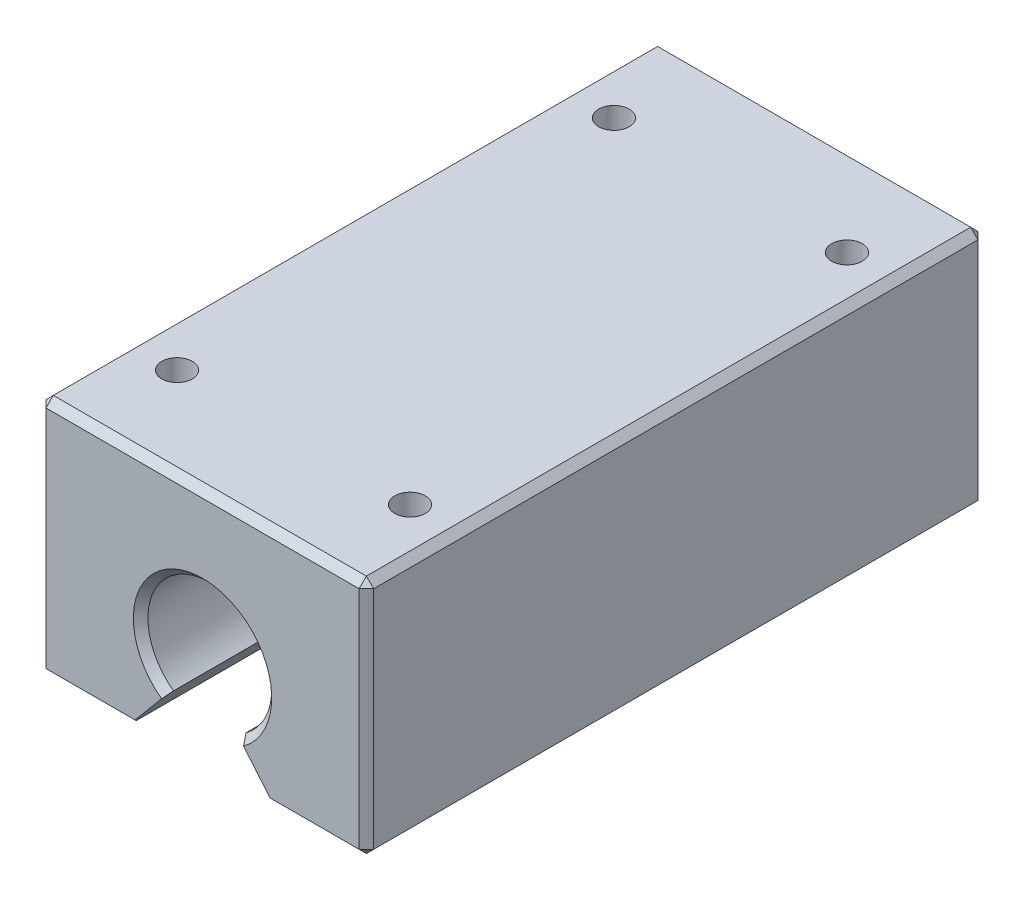
ISO-10303-21;
HEADER;
FILE_DESCRIPTION(('STEP AP214'),'2;1');
FILE_NAME('part.step','',(''),(''),'','','');
FILE_SCHEMA(('AUTOMOTIVE_DESIGN { 1 0 10303 214 1 1 1 1 }'));
ENDSEC;
DATA;
#1=APPLICATION_CONTEXT('core data for automotive mechanical design processes');
#2=APPLICATION_PROTOCOL_DEFINITION('international standard','automotive_design',2000,#1);
#3=PRODUCT_CONTEXT('',#1,'mechanical');
#4=PRODUCT('Part','Part','',(#3));
#5=PRODUCT_RELATED_PRODUCT_CATEGORY('part','',(#4));
#6=PRODUCT_DEFINITION_FORMATION('','',#4);
#7=PRODUCT_DEFINITION_CONTEXT('part definition',#1,'design');
#8=PRODUCT_DEFINITION('design','',#6,#7);
#9=PRODUCT_DEFINITION_SHAPE('','',#8);
#10=(LENGTH_UNIT() NAMED_UNIT(*) SI_UNIT(.MILLI.,.METRE.));
#11=(NAMED_UNIT(*) PLANE_ANGLE_UNIT() SI_UNIT($,.RADIAN.));
#12=(NAMED_UNIT(*) SI_UNIT($,.STERADIAN.) SOLID_ANGLE_UNIT());
#13=UNCERTAINTY_MEASURE_WITH_UNIT(LENGTH_MEASURE(1.E-05),#10,'distance_accuracy_value','');
#14=(GEOMETRIC_REPRESENTATION_CONTEXT(3) GLOBAL_UNCERTAINTY_ASSIGNED_CONTEXT((#13)) GLOBAL_UNIT_ASSIGNED_CONTEXT((#10,
#11,#12)) REPRESENTATION_CONTEXT('',''));
#15=CARTESIAN_POINT('',(0.,0.,0.));
#16=DIRECTION('',(0.,0.,1.));
#17=DIRECTION('',(1.,0.,0.));
#18=AXIS2_PLACEMENT_3D('',#15,#16,#17);
#19=CARTESIAN_POINT('',(-22.5,-16.5,85.));
#20=DIRECTION('',(0.,1.,0.));
#21=DIRECTION('',(0.,0.,1.));
#22=AXIS2_PLACEMENT_3D('',#19,#20,#21);
#23=PLANE('',#22);
#24=DIRECTION('',(0.,0.,1.));
#25=VECTOR('',#24,1.);
#26=CARTESIAN_POINT('',(21.5,-16.5,85.));
#27=LINE('',#26,#25);
#28=CARTESIAN_POINT('',(21.5,-16.5,1.));
#29=VERTEX_POINT('',#28);
#30=CARTESIAN_POINT('',(21.5,-16.5,84.));
#31=VERTEX_POINT('',#30);
#32=EDGE_CURVE('E341',#29,#31,#27,.T.);
#33=ORIENTED_EDGE('',*,*,#32,.T.);
#34=DIRECTION('',(-1.,0.,0.));
#35=VECTOR('',#34,1.);
#36=CARTESIAN_POINT('',(-22.5,-16.5,84.));
#37=LINE('',#36,#35);
#38=CARTESIAN_POINT('',(10.1133686516864,-16.5,84.));
#39=VERTEX_POINT('',#38);
#40=EDGE_CURVE('E343',#31,#39,#37,.T.);
#41=ORIENTED_EDGE('',*,*,#40,.T.);
#42=DIRECTION('',(0.,0.,-1.));
#43=VECTOR('',#42,1.);
#44=CARTESIAN_POINT('',(10.1133686516864,-16.5,85.));
#45=LINE('',#44,#43);
#46=CARTESIAN_POINT('',(10.1133686516864,-16.5,1.));
#47=VERTEX_POINT('',#46);
#48=EDGE_CURVE('E233',#39,#47,#45,.T.);
#49=ORIENTED_EDGE('',*,*,#48,.T.);
#50=DIRECTION('',(1.,0.,0.));
#51=VECTOR('',#50,1.);
#52=CARTESIAN_POINT('',(22.5,-16.5,1.));
#53=LINE('',#52,#51);
#54=EDGE_CURVE('E339',#47,#29,#53,.T.);
#55=ORIENTED_EDGE('',*,*,#54,.T.);
#56=EDGE_LOOP('',(#33,#41,#49,#55));
#57=FACE_BOUND('',#56,.T.);
#58=ADVANCED_FACE('F36',(#57),#23,.F.);
#59=CARTESIAN_POINT('',(22.5,-16.5,85.));
#60=DIRECTION('',(-1.,0.,0.));
#61=DIRECTION('',(0.,0.,1.));
#62=AXIS2_PLACEMENT_3D('',#59,#60,#61);
#63=PLANE('',#62);
#64=DIRECTION('',(0.,-1.,0.));
#65=VECTOR('',#64,1.);
#66=CARTESIAN_POINT('',(22.5,-16.5,84.));
#67=LINE('',#66,#65);
#68=CARTESIAN_POINT('',(22.5,15.5,84.));
#69=VERTEX_POINT('',#68);
#70=CARTESIAN_POINT('',(22.5,-15.5,84.));
#71=VERTEX_POINT('',#70);
#72=EDGE_CURVE('E364',#69,#71,#67,.T.);
#73=ORIENTED_EDGE('',*,*,#72,.T.);
#74=DIRECTION('',(0.,0.,-1.));
#75=VECTOR('',#74,1.);
#76=CARTESIAN_POINT('',(22.5,-15.5,85.));
#77=LINE('',#76,#75);
#78=CARTESIAN_POINT('',(22.5,-15.5,1.));
#79=VERTEX_POINT('',#78);
#80=EDGE_CURVE('E366',#71,#79,#77,.T.);
#81=ORIENTED_EDGE('',*,*,#80,.T.);
#82=DIRECTION('',(0.,1.,0.));
#83=VECTOR('',#82,1.);
#84=CARTESIAN_POINT('',(22.5,16.5,1.));
#85=LINE('',#84,#83);
#86=CARTESIAN_POINT('',(22.5,15.5,1.));
#87=VERTEX_POINT('',#86);
#88=EDGE_CURVE('E360',#79,#87,#85,.T.);
#89=ORIENTED_EDGE('',*,*,#88,.T.);
#90=DIRECTION('',(0.,0.,1.));
#91=VECTOR('',#90,1.);
#92=CARTESIAN_POINT('',(22.5,15.5,85.));
#93=LINE('',#92,#91);
#94=EDGE_CURVE('E362',#87,#69,#93,.T.);
#95=ORIENTED_EDGE('',*,*,#94,.T.);
#96=EDGE_LOOP('',(#73,#81,#89,#95));
#97=FACE_BOUND('',#96,.T.);
#98=ADVANCED_FACE('F306',(#97),#63,.F.);
#99=CARTESIAN_POINT('',(-22.5,16.5,85.));
#100=DIRECTION('',(0.,-1.,0.));
#101=DIRECTION('',(0.,0.,-1.));
#102=AXIS2_PLACEMENT_3D('',#99,#100,#101);
#103=PLANE('',#102);
#104=DIRECTION('',(0.,0.,-1.));
#105=VECTOR('',#104,1.);
#106=CARTESIAN_POINT('',(21.5,16.5,85.));
#107=LINE('',#106,#105);
#108=CARTESIAN_POINT('',(21.5,16.5,84.));
#109=VERTEX_POINT('',#108);
#110=CARTESIAN_POINT('',(21.5,16.5,1.));
#111=VERTEX_POINT('',#110);
#112=EDGE_CURVE('E369',#109,#111,#107,.T.);
#113=ORIENTED_EDGE('',*,*,#112,.T.);
#114=DIRECTION('',(-1.,0.,0.));
#115=VECTOR('',#114,1.);
#116=CARTESIAN_POINT('',(-22.5,16.5,1.));
#117=LINE('',#116,#115);
#118=CARTESIAN_POINT('',(-21.5,16.5,1.));
#119=VERTEX_POINT('',#118);
#120=EDGE_CURVE('E11',#111,#119,#117,.T.);
#121=ORIENTED_EDGE('',*,*,#120,.T.);
#122=DIRECTION('',(0.,0.,1.));
#123=VECTOR('',#122,1.);
#124=CARTESIAN_POINT('',(-21.5,16.5,85.));
#125=LINE('',#124,#123);
#126=CARTESIAN_POINT('',(-21.5,16.5,84.));
#127=VERTEX_POINT('',#126);
#128=EDGE_CURVE('E45',#119,#127,#125,.T.);
#129=ORIENTED_EDGE('',*,*,#128,.T.);
#130=DIRECTION('',(1.,0.,0.));
#131=VECTOR('',#130,1.);
#132=CARTESIAN_POINT('',(-22.5,16.5,84.));
#133=LINE('',#132,#131);
#134=EDGE_CURVE('E371',#127,#109,#133,.T.);
#135=ORIENTED_EDGE('',*,*,#134,.T.);
#136=EDGE_LOOP('',(#113,#121,#129,#135));
#137=FACE_BOUND('',#136,.T.);
#138=CARTESIAN_POINT('',(-16.,16.5,12.5));
#139=DIRECTION('',(0.,1.,0.));
#140=DIRECTION('',(0.,0.,1.));
#141=AXIS2_PLACEMENT_3D('',#138,#139,#140);
#142=CIRCLE('',#141,2.09999999999999);
#143=CARTESIAN_POINT('',(-16.,16.5,14.6));
#144=VERTEX_POINT('',#143);
#145=EDGE_CURVE('E193',#144,#144,#142,.T.);
#146=ORIENTED_EDGE('',*,*,#145,.F.);
#147=EDGE_LOOP('',(#146));
#148=FACE_BOUND('',#147,.T.);
#149=CARTESIAN_POINT('',(16.,16.5,12.5));
#150=DIRECTION('',(0.,1.,0.));
#151=DIRECTION('',(0.,0.,1.));
#152=AXIS2_PLACEMENT_3D('',#149,#150,#151);
#153=CIRCLE('',#152,2.09999999999999);
#154=CARTESIAN_POINT('',(16.,16.5,14.6));
#155=VERTEX_POINT('',#154);
#156=EDGE_CURVE('E192',#155,#155,#153,.T.);
#157=ORIENTED_EDGE('',*,*,#156,.F.);
#158=EDGE_LOOP('',(#157));
#159=FACE_BOUND('',#158,.T.);
#160=CARTESIAN_POINT('',(16.,16.5,72.5));
#161=DIRECTION('',(0.,1.,0.));
#162=DIRECTION('',(0.,0.,1.));
#163=AXIS2_PLACEMENT_3D('',#160,#161,#162);
#164=CIRCLE('',#163,2.09999999999999);
#165=CARTESIAN_POINT('',(16.,16.5,74.6));
#166=VERTEX_POINT('',#165);
#167=EDGE_CURVE('E203',#166,#166,#164,.T.);
#168=ORIENTED_EDGE('',*,*,#167,.F.);
#169=EDGE_LOOP('',(#168));
#170=FACE_BOUND('',#169,.T.);
#171=CARTESIAN_POINT('',(-16.,16.5,72.5));
#172=DIRECTION('',(0.,1.,0.));
#173=DIRECTION('',(0.,0.,1.));
#174=AXIS2_PLACEMENT_3D('',#171,#172,#173);
#175=CIRCLE('',#174,2.09999999999999);
#176=CARTESIAN_POINT('',(-16.,16.5,74.6));
#177=VERTEX_POINT('',#176);
#178=EDGE_CURVE('E209',#177,#177,#175,.T.);
#179=ORIENTED_EDGE('',*,*,#178,.F.);
#180=EDGE_LOOP('',(#179));
#181=FACE_BOUND('',#180,.T.);
#182=ADVANCED_FACE('F302',(#137,#148,#159,#170,#181),#103,.F.);
#183=CARTESIAN_POINT('',(-22.5,-16.5,85.));
#184=DIRECTION('',(1.,0.,0.));
#185=DIRECTION('',(0.,0.,-1.));
#186=AXIS2_PLACEMENT_3D('',#183,#184,#185);
#187=PLANE('',#186);
#188=DIRECTION('',(0.,-1.,0.));
#189=VECTOR('',#188,1.);
#190=CARTESIAN_POINT('',(-22.5,-16.5,1.));
#191=LINE('',#190,#189);
#192=CARTESIAN_POINT('',(-22.5,15.5,1.));
#193=VERTEX_POINT('',#192);
#194=CARTESIAN_POINT('',(-22.5,-15.5,1.));
#195=VERTEX_POINT('',#194);
#196=EDGE_CURVE('E355',#193,#195,#191,.T.);
#197=ORIENTED_EDGE('',*,*,#196,.T.);
#198=DIRECTION('',(0.,0.,1.));
#199=VECTOR('',#198,1.);
#200=CARTESIAN_POINT('',(-22.5,-15.5,85.));
#201=LINE('',#200,#199);
#202=CARTESIAN_POINT('',(-22.5,-15.5,84.));
#203=VERTEX_POINT('',#202);
#204=EDGE_CURVE('E357',#195,#203,#201,.T.);
#205=ORIENTED_EDGE('',*,*,#204,.T.);
#206=DIRECTION('',(0.,1.,0.));
#207=VECTOR('',#206,1.);
#208=CARTESIAN_POINT('',(-22.5,-16.5,84.));
#209=LINE('',#208,#207);
#210=CARTESIAN_POINT('',(-22.5,15.5,84.));
#211=VERTEX_POINT('',#210);
#212=EDGE_CURVE('E353',#203,#211,#209,.T.);
#213=ORIENTED_EDGE('',*,*,#212,.T.);
#214=DIRECTION('',(0.,0.,-1.));
#215=VECTOR('',#214,1.);
#216=CARTESIAN_POINT('',(-22.5,15.5,85.));
#217=LINE('',#216,#215);
#218=EDGE_CURVE('E351',#211,#193,#217,.T.);
#219=ORIENTED_EDGE('',*,*,#218,.T.);
#220=EDGE_LOOP('',(#197,#205,#213,#219));
#221=FACE_BOUND('',#220,.T.);
#222=ADVANCED_FACE('F298',(#221),#187,.F.);
#223=DIRECTION('',(0.,0.,1.));
#224=VECTOR('',#223,1.);
#225=CARTESIAN_POINT('',(-10.1133686516864,-16.5,85.));
#226=LINE('',#225,#224);
#227=CARTESIAN_POINT('',(-10.1133686516864,-16.5,1.));
#228=VERTEX_POINT('',#227);
#229=CARTESIAN_POINT('',(-10.1133686516864,-16.5,84.));
#230=VERTEX_POINT('',#229);
#231=EDGE_CURVE('E228',#228,#230,#226,.T.);
#232=ORIENTED_EDGE('',*,*,#231,.T.);
#233=DIRECTION('',(-1.,0.,0.));
#234=VECTOR('',#233,1.);
#235=CARTESIAN_POINT('',(-22.5,-16.5,84.));
#236=LINE('',#235,#234);
#237=CARTESIAN_POINT('',(-21.5,-16.5,84.));
#238=VERTEX_POINT('',#237);
#239=EDGE_CURVE('E349',#230,#238,#236,.T.);
#240=ORIENTED_EDGE('',*,*,#239,.T.);
#241=DIRECTION('',(0.,0.,-1.));
#242=VECTOR('',#241,1.);
#243=CARTESIAN_POINT('',(-21.5,-16.5,85.));
#244=LINE('',#243,#242);
#245=CARTESIAN_POINT('',(-21.5,-16.5,1.));
#246=VERTEX_POINT('',#245);
#247=EDGE_CURVE('E347',#238,#246,#244,.T.);
#248=ORIENTED_EDGE('',*,*,#247,.T.);
#249=DIRECTION('',(1.,0.,0.));
#250=VECTOR('',#249,1.);
#251=CARTESIAN_POINT('',(-10.1133686516864,-16.5,1.));
#252=LINE('',#251,#250);
#253=EDGE_CURVE('E345',#246,#228,#252,.T.);
#254=ORIENTED_EDGE('',*,*,#253,.T.);
#255=EDGE_LOOP('',(#232,#240,#248,#254));
#256=FACE_BOUND('',#255,.T.);
#257=ADVANCED_FACE('F291',(#256),#23,.F.);
#258=CARTESIAN_POINT('',(22.5,16.5,85.));
#259=DIRECTION('',(0.,0.,-1.));
#260=DIRECTION('',(-1.,0.,0.));
#261=AXIS2_PLACEMENT_3D('',#258,#259,#260);
#262=PLANE('',#261);
#263=DIRECTION('',(-0.642787609686538,-0.766044443118979,0.));
#264=VECTOR('',#263,1.);
#265=CARTESIAN_POINT('',(-21.218120664331,-29.734128105937,85.));
#266=LINE('',#265,#264);
#267=CARTESIAN_POINT('',(-5.62744217919717,-11.1538810102975,85.));
#268=VERTEX_POINT('',#267);
#269=CARTESIAN_POINT('',(-9.2742690205091,-15.5,85.));
#270=VERTEX_POINT('',#269);
#271=EDGE_CURVE('E215',#268,#270,#266,.T.);
#272=ORIENTED_EDGE('',*,*,#271,.F.);
#273=CARTESIAN_POINT('',(0.,-3.49999999999999,85.));
#274=DIRECTION('',(0.,0.,-1.));
#275=DIRECTION('',(-1.,0.,0.));
#276=AXIS2_PLACEMENT_3D('',#273,#274,#275);
#277=CIRCLE('',#276,9.50000000000001);
#278=CARTESIAN_POINT('',(5.62744217919718,-11.1538810102975,85.));
#279=VERTEX_POINT('',#278);
#280=EDGE_CURVE('E337',#268,#279,#277,.T.);
#281=ORIENTED_EDGE('',*,*,#280,.T.);
#282=DIRECTION('',(-0.642787609686538,0.766044443118979,0.));
#283=VECTOR('',#282,1.);
#284=CARTESIAN_POINT('',(21.218120664331,-29.734128105937,85.));
#285=LINE('',#284,#283);
#286=CARTESIAN_POINT('',(9.27426902050911,-15.5,85.));
#287=VERTEX_POINT('',#286);
#288=EDGE_CURVE('E220',#287,#279,#285,.T.);
#289=ORIENTED_EDGE('',*,*,#288,.F.);
#290=DIRECTION('',(1.,0.,0.));
#291=VECTOR('',#290,1.);
#292=CARTESIAN_POINT('',(22.5,-15.5,85.));
#293=LINE('',#292,#291);
#294=CARTESIAN_POINT('',(21.5,-15.5,85.));
#295=VERTEX_POINT('',#294);
#296=EDGE_CURVE('E334',#287,#295,#293,.T.);
#297=ORIENTED_EDGE('',*,*,#296,.T.);
#298=DIRECTION('',(0.,1.,0.));
#299=VECTOR('',#298,1.);
#300=CARTESIAN_POINT('',(21.5,16.5,85.));
#301=LINE('',#300,#299);
#302=CARTESIAN_POINT('',(21.5,15.5,85.));
#303=VERTEX_POINT('',#302);
#304=EDGE_CURVE('E328',#295,#303,#301,.T.);
#305=ORIENTED_EDGE('',*,*,#304,.T.);
#306=DIRECTION('',(-1.,0.,0.));
#307=VECTOR('',#306,1.);
#308=CARTESIAN_POINT('',(22.5,15.5,85.));
#309=LINE('',#308,#307);
#310=CARTESIAN_POINT('',(-21.5,15.5,85.));
#311=VERTEX_POINT('',#310);
#312=EDGE_CURVE('E321',#303,#311,#309,.T.);
#313=ORIENTED_EDGE('',*,*,#312,.T.);
#314=DIRECTION('',(0.,-1.,0.));
#315=VECTOR('',#314,1.);
#316=CARTESIAN_POINT('',(-21.5,16.5,85.));
#317=LINE('',#316,#315);
#318=CARTESIAN_POINT('',(-21.5,-15.5,85.));
#319=VERTEX_POINT('',#318);
#320=EDGE_CURVE('E330',#311,#319,#317,.T.);
#321=ORIENTED_EDGE('',*,*,#320,.T.);
#322=DIRECTION('',(1.,0.,0.));
#323=VECTOR('',#322,1.);
#324=CARTESIAN_POINT('',(22.5,-15.5,85.));
#325=LINE('',#324,#323);
#326=EDGE_CURVE('E332',#319,#270,#325,.T.);
#327=ORIENTED_EDGE('',*,*,#326,.T.);
#328=EDGE_LOOP('',(#272,#281,#289,#297,#305,#313,#321,#327));
#329=FACE_BOUND('',#328,.T.);
#330=ADVANCED_FACE('F287',(#329),#262,.F.);
#331=CARTESIAN_POINT('',(22.5,16.5,0.));
#332=DIRECTION('',(0.,0.,-1.));
#333=DIRECTION('',(-1.,0.,0.));
#334=AXIS2_PLACEMENT_3D('',#331,#332,#333);
#335=PLANE('',#334);
#336=DIRECTION('',(0.642787609686538,-0.766044443118979,0.));
#337=VECTOR('',#336,1.);
#338=CARTESIAN_POINT('',(-1.01810157939162,-3.23403036125723,0.));
#339=LINE('',#338,#337);
#340=CARTESIAN_POINT('',(5.62744217919718,-11.1538810102975,0.));
#341=VERTEX_POINT('',#340);
#342=CARTESIAN_POINT('',(9.27426902050911,-15.5,0.));
#343=VERTEX_POINT('',#342);
#344=EDGE_CURVE('E236',#341,#343,#339,.T.);
#345=ORIENTED_EDGE('',*,*,#344,.F.);
#346=CARTESIAN_POINT('',(0.,-3.49999999999999,0.));
#347=DIRECTION('',(0.,0.,-1.));
#348=DIRECTION('',(-1.,0.,0.));
#349=AXIS2_PLACEMENT_3D('',#346,#347,#348);
#350=CIRCLE('',#349,9.50000000000001);
#351=CARTESIAN_POINT('',(-5.62744217919717,-11.1538810102975,0.));
#352=VERTEX_POINT('',#351);
#353=EDGE_CURVE('E249',#341,#352,#350,.F.);
#354=ORIENTED_EDGE('',*,*,#353,.T.);
#355=DIRECTION('',(-0.642787609686538,-0.766044443118979,0.));
#356=VECTOR('',#355,1.);
#357=CARTESIAN_POINT('',(-21.218120664331,-29.734128105937,0.));
#358=LINE('',#357,#356);
#359=CARTESIAN_POINT('',(-9.2742690205091,-15.5,0.));
#360=VERTEX_POINT('',#359);
#361=EDGE_CURVE('E216',#352,#360,#358,.T.);
#362=ORIENTED_EDGE('',*,*,#361,.T.);
#363=DIRECTION('',(-1.,0.,0.));
#364=VECTOR('',#363,1.);
#365=CARTESIAN_POINT('',(-22.5,-15.5,0.));
#366=LINE('',#365,#364);
#367=CARTESIAN_POINT('',(-21.5,-15.5,0.));
#368=VERTEX_POINT('',#367);
#369=EDGE_CURVE('E247',#360,#368,#366,.T.);
#370=ORIENTED_EDGE('',*,*,#369,.T.);
#371=DIRECTION('',(0.,1.,0.));
#372=VECTOR('',#371,1.);
#373=CARTESIAN_POINT('',(-21.5,16.5,0.));
#374=LINE('',#373,#372);
#375=CARTESIAN_POINT('',(-21.5,15.5,0.));
#376=VERTEX_POINT('',#375);
#377=EDGE_CURVE('E243',#368,#376,#374,.T.);
#378=ORIENTED_EDGE('',*,*,#377,.T.);
#379=DIRECTION('',(1.,0.,0.));
#380=VECTOR('',#379,1.);
#381=CARTESIAN_POINT('',(22.5,15.5,0.));
#382=LINE('',#381,#380);
#383=CARTESIAN_POINT('',(21.5,15.5,0.));
#384=VERTEX_POINT('',#383);
#385=EDGE_CURVE('E241',#376,#384,#382,.T.);
#386=ORIENTED_EDGE('',*,*,#385,.T.);
#387=DIRECTION('',(0.,-1.,0.));
#388=VECTOR('',#387,1.);
#389=CARTESIAN_POINT('',(21.5,-16.5,0.));
#390=LINE('',#389,#388);
#391=CARTESIAN_POINT('',(21.5,-15.5,0.));
#392=VERTEX_POINT('',#391);
#393=EDGE_CURVE('E239',#384,#392,#390,.T.);
#394=ORIENTED_EDGE('',*,*,#393,.T.);
#395=DIRECTION('',(-1.,0.,0.));
#396=VECTOR('',#395,1.);
#397=CARTESIAN_POINT('',(10.1133686516864,-15.5,0.));
#398=LINE('',#397,#396);
#399=EDGE_CURVE('E245',#392,#343,#398,.T.);
#400=ORIENTED_EDGE('',*,*,#399,.T.);
#401=EDGE_LOOP('',(#345,#354,#362,#370,#378,#386,#394,#400));
#402=FACE_BOUND('',#401,.T.);
#403=ADVANCED_FACE('F290',(#402),#335,.T.);
#404=CARTESIAN_POINT('',(21.218120664331,-29.734128105937,0.));
#405=DIRECTION('',(0.766044443118979,0.642787609686538,0.));
#406=DIRECTION('',(-0.642787609686538,0.766044443118979,0.));
#407=AXIS2_PLACEMENT_3D('',#404,#405,#406);
#408=PLANE('',#407);
#409=DIRECTION('',(0.,0.,1.));
#410=VECTOR('',#409,1.);
#411=CARTESIAN_POINT('',(4.98317354561926,-10.3860715516352,0.));
#412=LINE('',#411,#410);
#413=CARTESIAN_POINT('',(4.98317354561926,-10.3860715516352,1.00000000000001));
#414=VERTEX_POINT('',#413);
#415=CARTESIAN_POINT('',(4.98317354561926,-10.3860715516352,84.));
#416=VERTEX_POINT('',#415);
#417=EDGE_CURVE('E225',#414,#416,#412,.T.);
#418=ORIENTED_EDGE('',*,*,#417,.F.);
#419=CARTESIAN_POINT('',(4.98317354561926,-10.3860715516352,1.00000000000001));
#420=CARTESIAN_POINT('',(5.09056538018604,-10.5140561562955,0.833354740954915));
#421=CARTESIAN_POINT('',(5.19795035027983,-10.6420325801954,0.666698778080025));
#422=CARTESIAN_POINT('',(5.41270656147247,-10.8979690664161,0.333365444746679));
#423=CARTESIAN_POINT('',(5.52007780257131,-11.025929128737,0.166688074288233));
#424=CARTESIAN_POINT('',(5.62744217919718,-11.1538810102975,0.));
#425=B_SPLINE_CURVE_WITH_KNOTS('',3,(#419,#420,#421,#422,#423,#424),.UNSPECIFIED.,.F.,.F.,(4,2,
4),(0.,0.707921861183899,1.41584372204485),.UNSPECIFIED.);
#426=EDGE_CURVE('E315',#414,#341,#425,.T.);
#427=ORIENTED_EDGE('',*,*,#426,.T.);
#428=ORIENTED_EDGE('',*,*,#344,.T.);
#429=DIRECTION('',(0.510273605374736,-0.608120402411343,0.608120402411343));
#430=VECTOR('',#429,1.);
#431=CARTESIAN_POINT('',(1.62152736713884,-6.37981764140059,-9.1201823585994));
#432=LINE('',#431,#430);
#433=EDGE_CURVE('E483',#343,#47,#432,.T.);
#434=ORIENTED_EDGE('',*,*,#433,.T.);
#435=ORIENTED_EDGE('',*,*,#48,.F.);
#436=DIRECTION('',(0.510273605374736,-0.608120402411343,-0.608120402411343));
#437=VECTOR('',#436,1.);
#438=CARTESIAN_POINT('',(12.717973642054,-19.6040473545594,80.8959526454406));
#439=LINE('',#438,#437);
#440=EDGE_CURVE('E485',#39,#287,#439,.F.);
#441=ORIENTED_EDGE('',*,*,#440,.T.);
#442=ORIENTED_EDGE('',*,*,#288,.T.);
#443=CARTESIAN_POINT('',(5.62744217919718,-11.1538810102975,85.));
#444=CARTESIAN_POINT('',(5.52007780257131,-11.025929128737,84.8333119257118));
#445=CARTESIAN_POINT('',(5.41270656147247,-10.8979690664161,84.6666345552533));
#446=CARTESIAN_POINT('',(5.19795035027983,-10.6420325801954,84.33330122192));
#447=CARTESIAN_POINT('',(5.09056538018604,-10.5140561562955,84.1666452590451));
#448=CARTESIAN_POINT('',(4.98317354561926,-10.3860715516352,84.));
#449=B_SPLINE_CURVE_WITH_KNOTS('',3,(#443,#444,#445,#446,#447,#448),.UNSPECIFIED.,.F.,.F.,(4,2,
4),(0.,0.707921860860956,1.41584372204485),.UNSPECIFIED.);
#450=EDGE_CURVE('E322',#279,#416,#449,.T.);
#451=ORIENTED_EDGE('',*,*,#450,.T.);
#452=EDGE_LOOP('',(#418,#427,#428,#434,#435,#441,#442,#451));
#453=FACE_BOUND('',#452,.T.);
#454=ADVANCED_FACE('F278',(#453),#408,.F.);
#455=CARTESIAN_POINT('',(-21.218120664331,-29.734128105937,0.));
#456=DIRECTION('',(-0.766044443118979,0.642787609686538,0.));
#457=DIRECTION('',(-0.642787609686538,-0.766044443118979,0.));
#458=AXIS2_PLACEMENT_3D('',#455,#456,#457);
#459=PLANE('',#458);
#460=ORIENTED_EDGE('',*,*,#361,.F.);
#461=CARTESIAN_POINT('',(-5.62744217919718,-11.1538810102975,0.));
#462=CARTESIAN_POINT('',(-5.52007780257131,-11.025929128737,0.166688074288233));
#463=CARTESIAN_POINT('',(-5.41270656147246,-10.8979690664161,0.333365444746678));
#464=CARTESIAN_POINT('',(-5.19795035027983,-10.6420325801954,0.666698778080024));
#465=CARTESIAN_POINT('',(-5.09056538018604,-10.5140561562955,0.833354740954914));
#466=CARTESIAN_POINT('',(-4.98317354561926,-10.3860715516353,1.00000000000001));
#467=B_SPLINE_CURVE_WITH_KNOTS('',3,(#461,#462,#463,#464,#465,#466),.UNSPECIFIED.,.F.,.F.,(4,2,
4),(0.,0.707921860860954,1.41584372204485),.UNSPECIFIED.);
#468=CARTESIAN_POINT('',(-4.98317354561926,-10.3860715516353,1.00000000000001));
#469=VERTEX_POINT('',#468);
#470=EDGE_CURVE('E263',#352,#469,#467,.T.);
#471=ORIENTED_EDGE('',*,*,#470,.T.);
#472=DIRECTION('',(0.,0.,1.));
#473=VECTOR('',#472,1.);
#474=CARTESIAN_POINT('',(-4.98317354561926,-10.3860715516353,0.));
#475=LINE('',#474,#473);
#476=CARTESIAN_POINT('',(-4.98317354561926,-10.3860715516353,84.));
#477=VERTEX_POINT('',#476);
#478=EDGE_CURVE('E219',#469,#477,#475,.T.);
#479=ORIENTED_EDGE('',*,*,#478,.T.);
#480=CARTESIAN_POINT('',(-4.98317354561926,-10.3860715516353,84.));
#481=CARTESIAN_POINT('',(-5.09056538018604,-10.5140561562955,84.1666452590451));
#482=CARTESIAN_POINT('',(-5.19795035027983,-10.6420325801954,84.33330122192));
#483=CARTESIAN_POINT('',(-5.41270656147246,-10.8979690664161,84.6666345552533));
#484=CARTESIAN_POINT('',(-5.52007780257131,-11.025929128737,84.8333119257118));
#485=CARTESIAN_POINT('',(-5.62744217919717,-11.1538810102975,85.));
#486=B_SPLINE_CURVE_WITH_KNOTS('',3,(#480,#481,#482,#483,#484,#485),.UNSPECIFIED.,.F.,.F.,(4,2,
4),(0.,0.707921861183893,1.41584372204485),.UNSPECIFIED.);
#487=EDGE_CURVE('E256',#477,#268,#486,.T.);
#488=ORIENTED_EDGE('',*,*,#487,.T.);
#489=ORIENTED_EDGE('',*,*,#271,.T.);
#490=DIRECTION('',(0.510273605374736,0.608120402411343,0.608120402411343));
#491=VECTOR('',#490,1.);
#492=CARTESIAN_POINT('',(-1.0009117866581,-5.64019679374274,94.8598032062573));
#493=LINE('',#492,#491);
#494=EDGE_CURVE('E254',#270,#230,#493,.F.);
#495=ORIENTED_EDGE('',*,*,#494,.T.);
#496=ORIENTED_EDGE('',*,*,#231,.F.);
#497=DIRECTION('',(0.510273605374736,0.608120402411343,-0.608120402411343));
#498=VECTOR('',#497,1.);
#499=CARTESIAN_POINT('',(-13.3385892225347,-20.3436682022173,4.84366820221731));
#500=LINE('',#499,#498);
#501=EDGE_CURVE('E252',#228,#360,#500,.T.);
#502=ORIENTED_EDGE('',*,*,#501,.T.);
#503=EDGE_LOOP('',(#460,#471,#479,#488,#489,#495,#496,#502));
#504=FACE_BOUND('',#503,.T.);
#505=ADVANCED_FACE('F272',(#504),#459,.F.);
#506=CARTESIAN_POINT('',(0.,-3.49999999999999,0.));
#507=DIRECTION('',(0.,0.,1.));
#508=DIRECTION('',(1.,0.,0.));
#509=AXIS2_PLACEMENT_3D('',#506,#507,#508);
#510=CYLINDRICAL_SURFACE('',#509,8.5);
#511=ORIENTED_EDGE('',*,*,#478,.F.);
#512=CARTESIAN_POINT('',(0.,-3.49999999999999,1.00000000000001));
#513=DIRECTION('',(0.,0.,-1.));
#514=DIRECTION('',(-1.,0.,0.));
#515=AXIS2_PLACEMENT_3D('',#512,#513,#514);
#516=CIRCLE('',#515,8.5);
#517=EDGE_CURVE('E479',#469,#414,#516,.T.);
#518=ORIENTED_EDGE('',*,*,#517,.T.);
#519=ORIENTED_EDGE('',*,*,#417,.T.);
#520=CARTESIAN_POINT('',(0.,-3.49999999999999,84.));
#521=DIRECTION('',(0.,0.,-1.));
#522=DIRECTION('',(-1.,0.,0.));
#523=AXIS2_PLACEMENT_3D('',#520,#521,#522);
#524=CIRCLE('',#523,8.5);
#525=EDGE_CURVE('E477',#416,#477,#524,.F.);
#526=ORIENTED_EDGE('',*,*,#525,.T.);
#527=EDGE_LOOP('',(#511,#518,#519,#526));
#528=FACE_BOUND('',#527,.T.);
#529=ADVANCED_FACE('F277',(#528),#510,.F.);
#530=CARTESIAN_POINT('',(-16.,6.50000000000001,72.5));
#531=DIRECTION('',(0.,1.,0.));
#532=DIRECTION('',(0.,0.,1.));
#533=AXIS2_PLACEMENT_3D('',#530,#531,#532);
#534=CONICAL_SURFACE('',#533,2.1,1.02974425867665);
#535=CARTESIAN_POINT('',(-16.,5.23819270004213,72.5));
#536=VERTEX_POINT('',#535);
#537=VERTEX_LOOP('',#536);
#538=FACE_BOUND('',#537,.T.);
#539=CARTESIAN_POINT('',(-16.,6.50000000000001,72.5));
#540=DIRECTION('',(0.,1.,0.));
#541=DIRECTION('',(0.,0.,1.));
#542=AXIS2_PLACEMENT_3D('',#539,#540,#541);
#543=CIRCLE('',#542,2.1);
#544=CARTESIAN_POINT('',(-16.,6.50000000000001,74.6));
#545=VERTEX_POINT('',#544);
#546=EDGE_CURVE('E212',#545,#545,#543,.T.);
#547=ORIENTED_EDGE('',*,*,#546,.T.);
#548=EDGE_LOOP('',(#547));
#549=FACE_BOUND('',#548,.T.);
#550=ADVANCED_FACE('F285',(#538,#549),#534,.F.);
#551=CARTESIAN_POINT('',(-16.,16.5,72.5));
#552=DIRECTION('',(0.,1.,0.));
#553=DIRECTION('',(0.,0.,1.));
#554=AXIS2_PLACEMENT_3D('',#551,#552,#553);
#555=CYLINDRICAL_SURFACE('',#554,2.09999999999999);
#556=ORIENTED_EDGE('',*,*,#546,.F.);
#557=EDGE_LOOP('',(#556));
#558=FACE_BOUND('',#557,.T.);
#559=ORIENTED_EDGE('',*,*,#178,.T.);
#560=EDGE_LOOP('',(#559));
#561=FACE_BOUND('',#560,.T.);
#562=ADVANCED_FACE('F781',(#558,#561),#555,.F.);
#563=CARTESIAN_POINT('',(16.,6.50000000000001,72.5));
#564=DIRECTION('',(0.,1.,0.));
#565=DIRECTION('',(0.,0.,1.));
#566=AXIS2_PLACEMENT_3D('',#563,#564,#565);
#567=CONICAL_SURFACE('',#566,2.1,1.02974425867665);
#568=CARTESIAN_POINT('',(16.,5.23819270004213,72.5));
#569=VERTEX_POINT('',#568);
#570=VERTEX_LOOP('',#569);
#571=FACE_BOUND('',#570,.T.);
#572=CARTESIAN_POINT('',(16.,6.50000000000001,72.5));
#573=DIRECTION('',(0.,1.,0.));
#574=DIRECTION('',(0.,0.,1.));
#575=AXIS2_PLACEMENT_3D('',#572,#573,#574);
#576=CIRCLE('',#575,2.1);
#577=CARTESIAN_POINT('',(16.,6.50000000000001,74.6));
#578=VERTEX_POINT('',#577);
#579=EDGE_CURVE('E206',#578,#578,#576,.T.);
#580=ORIENTED_EDGE('',*,*,#579,.T.);
#581=EDGE_LOOP('',(#580));
#582=FACE_BOUND('',#581,.T.);
#583=ADVANCED_FACE('F771',(#571,#582),#567,.F.);
#584=CARTESIAN_POINT('',(16.,16.5,72.5));
#585=DIRECTION('',(0.,1.,0.));
#586=DIRECTION('',(0.,0.,1.));
#587=AXIS2_PLACEMENT_3D('',#584,#585,#586);
#588=CYLINDRICAL_SURFACE('',#587,2.09999999999999);
#589=ORIENTED_EDGE('',*,*,#579,.F.);
#590=EDGE_LOOP('',(#589));
#591=FACE_BOUND('',#590,.T.);
#592=ORIENTED_EDGE('',*,*,#167,.T.);
#593=EDGE_LOOP('',(#592));
#594=FACE_BOUND('',#593,.T.);
#595=ADVANCED_FACE('F762',(#591,#594),#588,.F.);
#596=CARTESIAN_POINT('',(16.,6.50000000000001,12.5));
#597=DIRECTION('',(0.,1.,0.));
#598=DIRECTION('',(0.,0.,1.));
#599=AXIS2_PLACEMENT_3D('',#596,#597,#598);
#600=CONICAL_SURFACE('',#599,2.1,1.02974425867665);
#601=CARTESIAN_POINT('',(16.,5.23819270004213,12.5));
#602=VERTEX_POINT('',#601);
#603=VERTEX_LOOP('',#602);
#604=FACE_BOUND('',#603,.T.);
#605=CARTESIAN_POINT('',(16.,6.50000000000001,12.5));
#606=DIRECTION('',(0.,1.,0.));
#607=DIRECTION('',(0.,0.,1.));
#608=AXIS2_PLACEMENT_3D('',#605,#606,#607);
#609=CIRCLE('',#608,2.1);
#610=CARTESIAN_POINT('',(16.,6.50000000000001,14.6));
#611=VERTEX_POINT('',#610);
#612=EDGE_CURVE('E196',#611,#611,#609,.T.);
#613=ORIENTED_EDGE('',*,*,#612,.T.);
#614=EDGE_LOOP('',(#613));
#615=FACE_BOUND('',#614,.T.);
#616=ADVANCED_FACE('F752',(#604,#615),#600,.F.);
#617=CARTESIAN_POINT('',(16.,16.5,12.5));
#618=DIRECTION('',(0.,1.,0.));
#619=DIRECTION('',(0.,0.,1.));
#620=AXIS2_PLACEMENT_3D('',#617,#618,#619);
#621=CYLINDRICAL_SURFACE('',#620,2.09999999999999);
#622=ORIENTED_EDGE('',*,*,#612,.F.);
#623=EDGE_LOOP('',(#622));
#624=FACE_BOUND('',#623,.T.);
#625=ORIENTED_EDGE('',*,*,#156,.T.);
#626=EDGE_LOOP('',(#625));
#627=FACE_BOUND('',#626,.T.);
#628=ADVANCED_FACE('F186',(#624,#627),#621,.F.);
#629=CARTESIAN_POINT('',(-16.,6.50000000000001,12.5));
#630=DIRECTION('',(0.,1.,0.));
#631=DIRECTION('',(0.,0.,1.));
#632=AXIS2_PLACEMENT_3D('',#629,#630,#631);
#633=CONICAL_SURFACE('',#632,2.1,1.02974425867665);
#634=CARTESIAN_POINT('',(-16.,5.23819270004213,12.5));
#635=VERTEX_POINT('',#634);
#636=VERTEX_LOOP('',#635);
#637=FACE_BOUND('',#636,.T.);
#638=CARTESIAN_POINT('',(-16.,6.50000000000001,12.5));
#639=DIRECTION('',(0.,1.,0.));
#640=DIRECTION('',(0.,0.,1.));
#641=AXIS2_PLACEMENT_3D('',#638,#639,#640);
#642=CIRCLE('',#641,2.1);
#643=CARTESIAN_POINT('',(-16.,6.50000000000001,14.6));
#644=VERTEX_POINT('',#643);
#645=EDGE_CURVE('E190',#644,#644,#642,.T.);
#646=ORIENTED_EDGE('',*,*,#645,.T.);
#647=EDGE_LOOP('',(#646));
#648=FACE_BOUND('',#647,.T.);
#649=ADVANCED_FACE('F182',(#637,#648),#633,.F.);
#650=CARTESIAN_POINT('',(-16.,16.5,12.5));
#651=DIRECTION('',(0.,1.,0.));
#652=DIRECTION('',(0.,0.,1.));
#653=AXIS2_PLACEMENT_3D('',#650,#651,#652);
#654=CYLINDRICAL_SURFACE('',#653,2.09999999999999);
#655=ORIENTED_EDGE('',*,*,#645,.F.);
#656=EDGE_LOOP('',(#655));
#657=FACE_BOUND('',#656,.T.);
#658=ORIENTED_EDGE('',*,*,#145,.T.);
#659=EDGE_LOOP('',(#658));
#660=FACE_BOUND('',#659,.T.);
#661=ADVANCED_FACE('F185',(#657,#660),#654,.F.);
#662=CARTESIAN_POINT('',(0.,-3.49999999999999,0.));
#663=DIRECTION('',(0.,0.,-1.));
#664=DIRECTION('',(-1.,0.,0.));
#665=AXIS2_PLACEMENT_3D('',#662,#663,#664);
#666=CONICAL_SURFACE('',#665,9.50000000000001,0.785398163397448);
#667=ORIENTED_EDGE('',*,*,#426,.F.);
#668=ORIENTED_EDGE('',*,*,#517,.F.);
#669=ORIENTED_EDGE('',*,*,#470,.F.);
#670=ORIENTED_EDGE('',*,*,#353,.F.);
#671=EDGE_LOOP('',(#667,#668,#669,#670));
#672=FACE_BOUND('',#671,.T.);
#673=ADVANCED_FACE('F309',(#672),#666,.F.);
#674=CARTESIAN_POINT('',(0.,-3.49999999999999,84.));
#675=DIRECTION('',(0.,0.,1.));
#676=DIRECTION('',(1.,0.,0.));
#677=AXIS2_PLACEMENT_3D('',#674,#675,#676);
#678=CONICAL_SURFACE('',#677,8.5,0.785398163397452);
#679=ORIENTED_EDGE('',*,*,#450,.F.);
#680=ORIENTED_EDGE('',*,*,#280,.F.);
#681=ORIENTED_EDGE('',*,*,#487,.F.);
#682=ORIENTED_EDGE('',*,*,#525,.F.);
#683=EDGE_LOOP('',(#679,#680,#681,#682));
#684=FACE_BOUND('',#683,.T.);
#685=ADVANCED_FACE('F269',(#684),#678,.F.);
#686=CARTESIAN_POINT('',(-22.5,-16.5,1.));
#687=DIRECTION('',(0.,-0.707106781186547,-0.707106781186547));
#688=DIRECTION('',(0.,0.707106781186548,-0.707106781186548));
#689=AXIS2_PLACEMENT_3D('',#686,#687,#688);
#690=PLANE('',#689);
#691=DIRECTION('',(0.,-0.707106781186547,0.707106781186547));
#692=VECTOR('',#691,1.);
#693=CARTESIAN_POINT('',(-21.5,-16.5,1.));
#694=LINE('',#693,#692);
#695=EDGE_CURVE('E40',#368,#246,#694,.T.);
#696=ORIENTED_EDGE('',*,*,#695,.F.);
#697=ORIENTED_EDGE('',*,*,#369,.F.);
#698=ORIENTED_EDGE('',*,*,#501,.F.);
#699=ORIENTED_EDGE('',*,*,#253,.F.);
#700=EDGE_LOOP('',(#696,#697,#698,#699));
#701=FACE_BOUND('',#700,.T.);
#702=ADVANCED_FACE('F38',(#701),#690,.T.);
#703=CARTESIAN_POINT('',(-21.5,-16.5,1.));
#704=DIRECTION('',(-0.577350269189626,-0.577350269189626,-0.577350269189626));
#705=DIRECTION('',(-0.707106781186547,0.,0.707106781186547));
#706=AXIS2_PLACEMENT_3D('',#703,#704,#705);
#707=PLANE('',#706);
#708=DIRECTION('',(0.707106781186547,0.,-0.707106781186547));
#709=VECTOR('',#708,1.);
#710=CARTESIAN_POINT('',(-22.,-15.5,0.5));
#711=LINE('',#710,#709);
#712=EDGE_CURVE('E434',#368,#195,#711,.F.);
#713=ORIENTED_EDGE('',*,*,#712,.F.);
#714=ORIENTED_EDGE('',*,*,#695,.T.);
#715=DIRECTION('',(0.707106781186547,-0.707106781186547,0.));
#716=VECTOR('',#715,1.);
#717=CARTESIAN_POINT('',(-21.5,-16.5,1.));
#718=LINE('',#717,#716);
#719=EDGE_CURVE('E436',#195,#246,#718,.T.);
#720=ORIENTED_EDGE('',*,*,#719,.F.);
#721=EDGE_LOOP('',(#713,#714,#720));
#722=FACE_BOUND('',#721,.T.);
#723=ADVANCED_FACE('F446',(#722),#707,.T.);
#724=CARTESIAN_POINT('',(22.5,-15.5,85.));
#725=DIRECTION('',(0.,0.707106781186547,-0.707106781186547));
#726=DIRECTION('',(0.,0.707106781186548,0.707106781186548));
#727=AXIS2_PLACEMENT_3D('',#724,#725,#726);
#728=PLANE('',#727);
#729=ORIENTED_EDGE('',*,*,#494,.F.);
#730=ORIENTED_EDGE('',*,*,#326,.F.);
#731=DIRECTION('',(0.,-0.707106781186547,-0.707106781186547));
#732=VECTOR('',#731,1.);
#733=CARTESIAN_POINT('',(-21.5,-16.5,84.));
#734=LINE('',#733,#732);
#735=EDGE_CURVE('E431',#238,#319,#734,.F.);
#736=ORIENTED_EDGE('',*,*,#735,.F.);
#737=ORIENTED_EDGE('',*,*,#239,.F.);
#738=EDGE_LOOP('',(#729,#730,#736,#737));
#739=FACE_BOUND('',#738,.T.);
#740=ADVANCED_FACE('F459',(#739),#728,.F.);
#741=CARTESIAN_POINT('',(-21.5,-16.5,85.));
#742=DIRECTION('',(0.707106781186547,0.707106781186547,0.));
#743=DIRECTION('',(-0.707106781186548,0.707106781186548,0.));
#744=AXIS2_PLACEMENT_3D('',#741,#742,#743);
#745=PLANE('',#744);
#746=ORIENTED_EDGE('',*,*,#719,.T.);
#747=ORIENTED_EDGE('',*,*,#247,.F.);
#748=DIRECTION('',(-0.707106781186547,0.707106781186547,0.));
#749=VECTOR('',#748,1.);
#750=CARTESIAN_POINT('',(-21.5,-16.5,84.));
#751=LINE('',#750,#749);
#752=EDGE_CURVE('E428',#203,#238,#751,.F.);
#753=ORIENTED_EDGE('',*,*,#752,.F.);
#754=ORIENTED_EDGE('',*,*,#204,.F.);
#755=EDGE_LOOP('',(#746,#747,#753,#754));
#756=FACE_BOUND('',#755,.T.);
#757=ADVANCED_FACE('F462',(#756),#745,.F.);
#758=CARTESIAN_POINT('',(-22.5,-16.5,1.));
#759=DIRECTION('',(-0.707106781186547,0.,-0.707106781186547));
#760=DIRECTION('',(-0.707106781186548,0.,0.707106781186548));
#761=AXIS2_PLACEMENT_3D('',#758,#759,#760);
#762=PLANE('',#761);
#763=ORIENTED_EDGE('',*,*,#712,.T.);
#764=ORIENTED_EDGE('',*,*,#196,.F.);
#765=DIRECTION('',(-0.707106781186547,0.,0.707106781186547));
#766=VECTOR('',#765,1.);
#767=CARTESIAN_POINT('',(-21.5,15.5,0.));
#768=LINE('',#767,#766);
#769=EDGE_CURVE('E425',#376,#193,#768,.T.);
#770=ORIENTED_EDGE('',*,*,#769,.F.);
#771=ORIENTED_EDGE('',*,*,#377,.F.);
#772=EDGE_LOOP('',(#763,#764,#770,#771));
#773=FACE_BOUND('',#772,.T.);
#774=ADVANCED_FACE('F469',(#773),#762,.T.);
#775=CARTESIAN_POINT('',(-21.5,-16.5,84.));
#776=DIRECTION('',(-0.577350269189626,-0.577350269189626,0.577350269189626));
#777=DIRECTION('',(0.707106781186547,0.,0.707106781186547));
#778=AXIS2_PLACEMENT_3D('',#775,#776,#777);
#779=PLANE('',#778);
#780=ORIENTED_EDGE('',*,*,#752,.T.);
#781=ORIENTED_EDGE('',*,*,#735,.T.);
#782=DIRECTION('',(0.707106781186547,0.,0.707106781186547));
#783=VECTOR('',#782,1.);
#784=CARTESIAN_POINT('',(-22.,-15.5,84.5));
#785=LINE('',#784,#783);
#786=EDGE_CURVE('E422',#203,#319,#785,.T.);
#787=ORIENTED_EDGE('',*,*,#786,.F.);
#788=EDGE_LOOP('',(#780,#781,#787));
#789=FACE_BOUND('',#788,.T.);
#790=ADVANCED_FACE('F679',(#789),#779,.T.);
#791=CARTESIAN_POINT('',(-21.5,15.5,0.));
#792=DIRECTION('',(-0.577350269189626,0.577350269189626,-0.577350269189626));
#793=DIRECTION('',(-0.707106781186547,0.,0.707106781186547));
#794=AXIS2_PLACEMENT_3D('',#791,#792,#793);
#795=PLANE('',#794);
#796=DIRECTION('',(0.,-0.707106781186547,-0.707106781186547));
#797=VECTOR('',#796,1.);
#798=CARTESIAN_POINT('',(-21.5,15.5,0.));
#799=LINE('',#798,#797);
#800=EDGE_CURVE('E417',#376,#119,#799,.F.);
#801=ORIENTED_EDGE('',*,*,#800,.F.);
#802=ORIENTED_EDGE('',*,*,#769,.T.);
#803=DIRECTION('',(-0.707106781186547,-0.707106781186547,0.));
#804=VECTOR('',#803,1.);
#805=CARTESIAN_POINT('',(-22.,16.,1.));
#806=LINE('',#805,#804);
#807=EDGE_CURVE('E420',#119,#193,#806,.T.);
#808=ORIENTED_EDGE('',*,*,#807,.F.);
#809=EDGE_LOOP('',(#801,#802,#808));
#810=FACE_BOUND('',#809,.T.);
#811=ADVANCED_FACE('F522',(#810),#795,.T.);
#812=CARTESIAN_POINT('',(-21.5,16.5,85.));
#813=DIRECTION('',(0.707106781186547,0.,-0.707106781186547));
#814=DIRECTION('',(-0.707106781186548,0.,-0.707106781186548));
#815=AXIS2_PLACEMENT_3D('',#812,#813,#814);
#816=PLANE('',#815);
#817=ORIENTED_EDGE('',*,*,#786,.T.);
#818=ORIENTED_EDGE('',*,*,#320,.F.);
#819=DIRECTION('',(-0.707106781186547,0.,-0.707106781186547));
#820=VECTOR('',#819,1.);
#821=CARTESIAN_POINT('',(-22.5,15.5,84.));
#822=LINE('',#821,#820);
#823=EDGE_CURVE('E414',#211,#311,#822,.F.);
#824=ORIENTED_EDGE('',*,*,#823,.F.);
#825=ORIENTED_EDGE('',*,*,#212,.F.);
#826=EDGE_LOOP('',(#817,#818,#824,#825));
#827=FACE_BOUND('',#826,.T.);
#828=ADVANCED_FACE('F498',(#827),#816,.F.);
#829=CARTESIAN_POINT('',(-22.5,15.5,85.));
#830=DIRECTION('',(0.707106781186547,-0.707106781186547,0.));
#831=DIRECTION('',(0.707106781186548,0.707106781186548,0.));
#832=AXIS2_PLACEMENT_3D('',#829,#830,#831);
#833=PLANE('',#832);
#834=ORIENTED_EDGE('',*,*,#807,.T.);
#835=ORIENTED_EDGE('',*,*,#218,.F.);
#836=DIRECTION('',(0.707106781186547,0.707106781186547,0.));
#837=VECTOR('',#836,1.);
#838=CARTESIAN_POINT('',(-22.5,15.5,84.));
#839=LINE('',#838,#837);
#840=EDGE_CURVE('E411',#127,#211,#839,.F.);
#841=ORIENTED_EDGE('',*,*,#840,.F.);
#842=ORIENTED_EDGE('',*,*,#128,.F.);
#843=EDGE_LOOP('',(#834,#835,#841,#842));
#844=FACE_BOUND('',#843,.T.);
#845=ADVANCED_FACE('F523',(#844),#833,.F.);
#846=CARTESIAN_POINT('',(-22.5,16.5,1.));
#847=DIRECTION('',(0.,0.707106781186547,-0.707106781186547));
#848=DIRECTION('',(0.,0.707106781186548,0.707106781186548));
#849=AXIS2_PLACEMENT_3D('',#846,#847,#848);
#850=PLANE('',#849);
#851=ORIENTED_EDGE('',*,*,#800,.T.);
#852=ORIENTED_EDGE('',*,*,#120,.F.);
#853=DIRECTION('',(0.,0.707106781186547,0.707106781186547));
#854=VECTOR('',#853,1.);
#855=CARTESIAN_POINT('',(21.5,15.5,0.));
#856=LINE('',#855,#854);
#857=EDGE_CURVE('E408',#384,#111,#856,.T.);
#858=ORIENTED_EDGE('',*,*,#857,.F.);
#859=ORIENTED_EDGE('',*,*,#385,.F.);
#860=EDGE_LOOP('',(#851,#852,#858,#859));
#861=FACE_BOUND('',#860,.T.);
#862=ADVANCED_FACE('F520',(#861),#850,.T.);
#863=CARTESIAN_POINT('',(-22.5,15.5,84.));
#864=DIRECTION('',(-0.577350269189626,0.577350269189626,0.577350269189626));
#865=DIRECTION('',(0.707106781186547,0.,0.707106781186547));
#866=AXIS2_PLACEMENT_3D('',#863,#864,#865);
#867=PLANE('',#866);
#868=ORIENTED_EDGE('',*,*,#840,.T.);
#869=ORIENTED_EDGE('',*,*,#823,.T.);
#870=DIRECTION('',(0.,-0.707106781186547,0.707106781186547));
#871=VECTOR('',#870,1.);
#872=CARTESIAN_POINT('',(-21.5,16.,84.5));
#873=LINE('',#872,#871);
#874=EDGE_CURVE('E405',#127,#311,#873,.T.);
#875=ORIENTED_EDGE('',*,*,#874,.F.);
#876=EDGE_LOOP('',(#868,#869,#875));
#877=FACE_BOUND('',#876,.T.);
#878=ADVANCED_FACE('F501',(#877),#867,.T.);
#879=CARTESIAN_POINT('',(21.5,15.5,0.));
#880=DIRECTION('',(0.577350269189626,0.577350269189626,-0.577350269189626));
#881=DIRECTION('',(-0.707106781186547,0.,-0.707106781186547));
#882=AXIS2_PLACEMENT_3D('',#879,#880,#881);
#883=PLANE('',#882);
#884=DIRECTION('',(-0.707106781186547,0.,-0.707106781186547));
#885=VECTOR('',#884,1.);
#886=CARTESIAN_POINT('',(21.5,15.5,0.));
#887=LINE('',#886,#885);
#888=EDGE_CURVE('E399',#384,#87,#887,.F.);
#889=ORIENTED_EDGE('',*,*,#888,.F.);
#890=ORIENTED_EDGE('',*,*,#857,.T.);
#891=DIRECTION('',(-0.707106781186547,0.707106781186547,0.));
#892=VECTOR('',#891,1.);
#893=CARTESIAN_POINT('',(22.,16.,1.));
#894=LINE('',#893,#892);
#895=EDGE_CURVE('E402',#87,#111,#894,.T.);
#896=ORIENTED_EDGE('',*,*,#895,.F.);
#897=EDGE_LOOP('',(#889,#890,#896));
#898=FACE_BOUND('',#897,.T.);
#899=ADVANCED_FACE('F517',(#898),#883,.T.);
#900=CARTESIAN_POINT('',(22.5,15.5,85.));
#901=DIRECTION('',(0.,-0.707106781186547,-0.707106781186547));
#902=DIRECTION('',(0.,0.707106781186548,-0.707106781186548));
#903=AXIS2_PLACEMENT_3D('',#900,#901,#902);
#904=PLANE('',#903);
#905=ORIENTED_EDGE('',*,*,#874,.T.);
#906=ORIENTED_EDGE('',*,*,#312,.F.);
#907=DIRECTION('',(0.,0.707106781186547,-0.707106781186547));
#908=VECTOR('',#907,1.);
#909=CARTESIAN_POINT('',(21.5,15.5,85.));
#910=LINE('',#909,#908);
#911=EDGE_CURVE('E396',#109,#303,#910,.F.);
#912=ORIENTED_EDGE('',*,*,#911,.F.);
#913=ORIENTED_EDGE('',*,*,#134,.F.);
#914=EDGE_LOOP('',(#905,#906,#912,#913));
#915=FACE_BOUND('',#914,.T.);
#916=ADVANCED_FACE('F504',(#915),#904,.F.);
#917=CARTESIAN_POINT('',(21.5,16.5,85.));
#918=DIRECTION('',(-0.707106781186547,-0.707106781186547,0.));
#919=DIRECTION('',(0.707106781186548,-0.707106781186548,0.));
#920=AXIS2_PLACEMENT_3D('',#917,#918,#919);
#921=PLANE('',#920);
#922=ORIENTED_EDGE('',*,*,#895,.T.);
#923=ORIENTED_EDGE('',*,*,#112,.F.);
#924=DIRECTION('',(0.707106781186547,-0.707106781186547,0.));
#925=VECTOR('',#924,1.);
#926=CARTESIAN_POINT('',(22.,16.,84.));
#927=LINE('',#926,#925);
#928=EDGE_CURVE('E393',#69,#109,#927,.F.);
#929=ORIENTED_EDGE('',*,*,#928,.F.);
#930=ORIENTED_EDGE('',*,*,#94,.F.);
#931=EDGE_LOOP('',(#922,#923,#929,#930));
#932=FACE_BOUND('',#931,.T.);
#933=ADVANCED_FACE('F511',(#932),#921,.F.);
#934=CARTESIAN_POINT('',(22.5,-16.5,1.));
#935=DIRECTION('',(0.707106781186547,0.,-0.707106781186547));
#936=DIRECTION('',(-0.707106781186548,0.,-0.707106781186548));
#937=AXIS2_PLACEMENT_3D('',#934,#935,#936);
#938=PLANE('',#937);
#939=ORIENTED_EDGE('',*,*,#888,.T.);
#940=ORIENTED_EDGE('',*,*,#88,.F.);
#941=DIRECTION('',(0.707106781186547,0.,0.707106781186547));
#942=VECTOR('',#941,1.);
#943=CARTESIAN_POINT('',(22.5,-15.5,1.));
#944=LINE('',#943,#942);
#945=EDGE_CURVE('E390',#392,#79,#944,.T.);
#946=ORIENTED_EDGE('',*,*,#945,.F.);
#947=ORIENTED_EDGE('',*,*,#393,.F.);
#948=EDGE_LOOP('',(#939,#940,#946,#947));
#949=FACE_BOUND('',#948,.T.);
#950=ADVANCED_FACE('F567',(#949),#938,.T.);
#951=CARTESIAN_POINT('',(-22.5,-16.5,1.));
#952=DIRECTION('',(0.,-0.707106781186547,-0.707106781186547));
#953=DIRECTION('',(0.,0.707106781186548,-0.707106781186548));
#954=AXIS2_PLACEMENT_3D('',#951,#952,#953);
#955=PLANE('',#954);
#956=ORIENTED_EDGE('',*,*,#433,.F.);
#957=ORIENTED_EDGE('',*,*,#399,.F.);
#958=DIRECTION('',(0.,0.707106781186547,-0.707106781186547));
#959=VECTOR('',#958,1.);
#960=CARTESIAN_POINT('',(21.5,-16.,0.5));
#961=LINE('',#960,#959);
#962=EDGE_CURVE('E387',#29,#392,#961,.T.);
#963=ORIENTED_EDGE('',*,*,#962,.F.);
#964=ORIENTED_EDGE('',*,*,#54,.F.);
#965=EDGE_LOOP('',(#956,#957,#963,#964));
#966=FACE_BOUND('',#965,.T.);
#967=ADVANCED_FACE('F559',(#966),#955,.T.);
#968=CARTESIAN_POINT('',(21.5,15.5,85.));
#969=DIRECTION('',(0.577350269189626,0.577350269189626,0.577350269189626));
#970=DIRECTION('',(0.707106781186547,0.,-0.707106781186547));
#971=AXIS2_PLACEMENT_3D('',#968,#969,#970);
#972=PLANE('',#971);
#973=ORIENTED_EDGE('',*,*,#928,.T.);
#974=ORIENTED_EDGE('',*,*,#911,.T.);
#975=DIRECTION('',(-0.707106781186547,0.,0.707106781186547));
#976=VECTOR('',#975,1.);
#977=CARTESIAN_POINT('',(21.5,15.5,85.));
#978=LINE('',#977,#976);
#979=EDGE_CURVE('E384',#69,#303,#978,.T.);
#980=ORIENTED_EDGE('',*,*,#979,.F.);
#981=EDGE_LOOP('',(#973,#974,#980));
#982=FACE_BOUND('',#981,.T.);
#983=ADVANCED_FACE('F556',(#982),#972,.T.);
#984=CARTESIAN_POINT('',(22.5,-15.5,1.));
#985=DIRECTION('',(0.577350269189626,-0.577350269189626,-0.577350269189626));
#986=DIRECTION('',(-0.707106781186547,0.,-0.707106781186547));
#987=AXIS2_PLACEMENT_3D('',#984,#985,#986);
#988=PLANE('',#987);
#989=ORIENTED_EDGE('',*,*,#962,.T.);
#990=ORIENTED_EDGE('',*,*,#945,.T.);
#991=DIRECTION('',(0.707106781186547,0.707106781186547,0.));
#992=VECTOR('',#991,1.);
#993=CARTESIAN_POINT('',(22.5,-15.5,1.));
#994=LINE('',#993,#992);
#995=EDGE_CURVE('E382',#29,#79,#994,.T.);
#996=ORIENTED_EDGE('',*,*,#995,.F.);
#997=EDGE_LOOP('',(#989,#990,#996));
#998=FACE_BOUND('',#997,.T.);
#999=ADVANCED_FACE('F558',(#998),#988,.T.);
#1000=CARTESIAN_POINT('',(21.5,16.5,85.));
#1001=DIRECTION('',(-0.707106781186547,0.,-0.707106781186547));
#1002=DIRECTION('',(-0.707106781186548,0.,0.707106781186548));
#1003=AXIS2_PLACEMENT_3D('',#1000,#1001,#1002);
#1004=PLANE('',#1003);
#1005=ORIENTED_EDGE('',*,*,#979,.T.);
#1006=ORIENTED_EDGE('',*,*,#304,.F.);
#1007=DIRECTION('',(0.707106781186547,0.,-0.707106781186547));
#1008=VECTOR('',#1007,1.);
#1009=CARTESIAN_POINT('',(21.5,-15.5,85.));
#1010=LINE('',#1009,#1008);
#1011=EDGE_CURVE('E379',#71,#295,#1010,.F.);
#1012=ORIENTED_EDGE('',*,*,#1011,.F.);
#1013=ORIENTED_EDGE('',*,*,#72,.F.);
#1014=EDGE_LOOP('',(#1005,#1006,#1012,#1013));
#1015=FACE_BOUND('',#1014,.T.);
#1016=ADVANCED_FACE('F554',(#1015),#1004,.F.);
#1017=CARTESIAN_POINT('',(22.5,-15.5,85.));
#1018=DIRECTION('',(-0.707106781186547,0.707106781186547,0.));
#1019=DIRECTION('',(-0.707106781186548,-0.707106781186548,0.));
#1020=AXIS2_PLACEMENT_3D('',#1017,#1018,#1019);
#1021=PLANE('',#1020);
#1022=ORIENTED_EDGE('',*,*,#995,.T.);
#1023=ORIENTED_EDGE('',*,*,#80,.F.);
#1024=DIRECTION('',(-0.707106781186547,-0.707106781186547,0.));
#1025=VECTOR('',#1024,1.);
#1026=CARTESIAN_POINT('',(22.,-16.,84.));
#1027=LINE('',#1026,#1025);
#1028=EDGE_CURVE('E376',#31,#71,#1027,.F.);
#1029=ORIENTED_EDGE('',*,*,#1028,.F.);
#1030=ORIENTED_EDGE('',*,*,#32,.F.);
#1031=EDGE_LOOP('',(#1022,#1023,#1029,#1030));
#1032=FACE_BOUND('',#1031,.T.);
#1033=ADVANCED_FACE('F543',(#1032),#1021,.F.);
#1034=CARTESIAN_POINT('',(21.5,-15.5,85.));
#1035=DIRECTION('',(0.577350269189626,-0.577350269189626,0.577350269189626));
#1036=DIRECTION('',(0.707106781186547,0.,-0.707106781186547));
#1037=AXIS2_PLACEMENT_3D('',#1034,#1035,#1036);
#1038=PLANE('',#1037);
#1039=ORIENTED_EDGE('',*,*,#1028,.T.);
#1040=ORIENTED_EDGE('',*,*,#1011,.T.);
#1041=DIRECTION('',(0.,0.707106781186547,0.707106781186547));
#1042=VECTOR('',#1041,1.);
#1043=CARTESIAN_POINT('',(21.5,-15.5,85.));
#1044=LINE('',#1043,#1042);
#1045=EDGE_CURVE('E374',#31,#295,#1044,.T.);
#1046=ORIENTED_EDGE('',*,*,#1045,.F.);
#1047=EDGE_LOOP('',(#1039,#1040,#1046));
#1048=FACE_BOUND('',#1047,.T.);
#1049=ADVANCED_FACE('F550',(#1048),#1038,.T.);
#1050=CARTESIAN_POINT('',(22.5,-15.5,85.));
#1051=DIRECTION('',(0.,0.707106781186547,-0.707106781186547));
#1052=DIRECTION('',(0.,0.707106781186548,0.707106781186548));
#1053=AXIS2_PLACEMENT_3D('',#1050,#1051,#1052);
#1054=PLANE('',#1053);
#1055=ORIENTED_EDGE('',*,*,#440,.F.);
#1056=ORIENTED_EDGE('',*,*,#40,.F.);
#1057=ORIENTED_EDGE('',*,*,#1045,.T.);
#1058=ORIENTED_EDGE('',*,*,#296,.F.);
#1059=EDGE_LOOP('',(#1055,#1056,#1057,#1058));
#1060=FACE_BOUND('',#1059,.T.);
#1061=ADVANCED_FACE('F548',(#1060),#1054,.F.);
#1062=CLOSED_SHELL('',(#58,#98,#182,#222,#257,#330,#403,#454,#505,#529,#550,#562,#583,#595,#616,
#628,#649,#661,#673,#685,#702,#723,#740,#757,#774,#790,#811,#828,#845,#862,#878,#899,#916,#933,
#950,#967,#983,#999,#1016,#1033,#1049,#1061));
#1063=MANIFOLD_SOLID_BREP('B2',#1062);
#1064=ADVANCED_BREP_SHAPE_REPRESENTATION('',(#18,#1063),#14);
#1065=SHAPE_DEFINITION_REPRESENTATION(#9,#1064);
ENDSEC;
END-ISO-10303-21;
